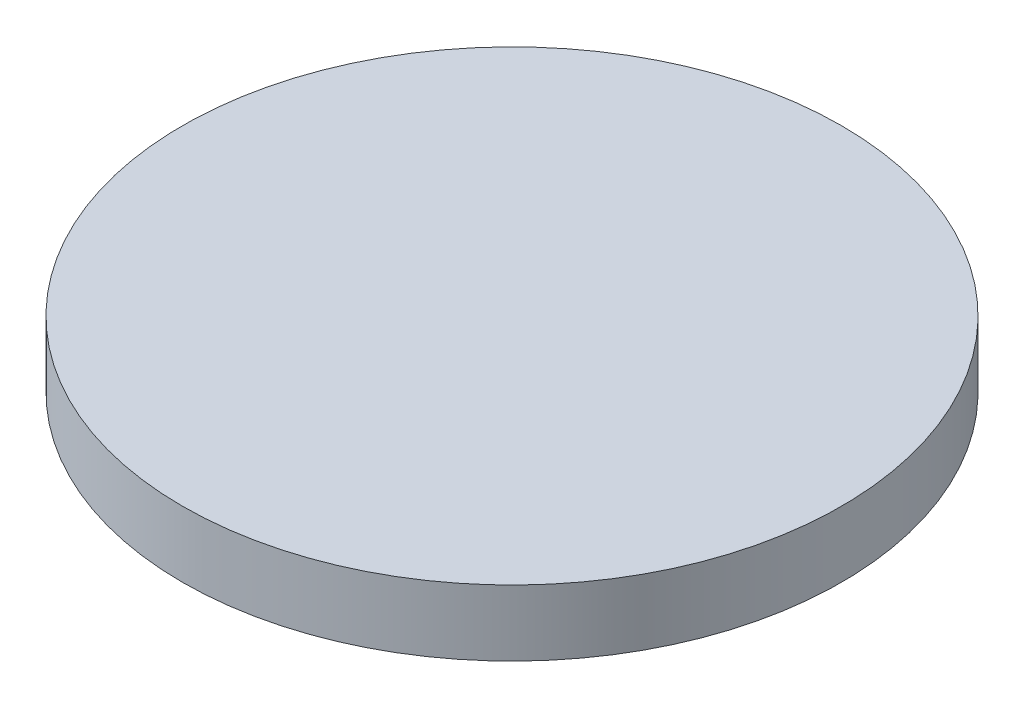
ISO-10303-21;
HEADER;
FILE_DESCRIPTION(('STEP AP214'),'2;1');
FILE_NAME('part.step','',(''),(''),'','','');
FILE_SCHEMA(('AUTOMOTIVE_DESIGN { 1 0 10303 214 1 1 1 1 }'));
ENDSEC;
DATA;
#1=APPLICATION_CONTEXT('core data for automotive mechanical design processes');
#2=APPLICATION_PROTOCOL_DEFINITION('international standard','automotive_design',2000,#1);
#3=PRODUCT_CONTEXT('',#1,'mechanical');
#4=PRODUCT('Part','Part','',(#3));
#5=PRODUCT_RELATED_PRODUCT_CATEGORY('part','',(#4));
#6=PRODUCT_DEFINITION_FORMATION('','',#4);
#7=PRODUCT_DEFINITION_CONTEXT('part definition',#1,'design');
#8=PRODUCT_DEFINITION('design','',#6,#7);
#9=PRODUCT_DEFINITION_SHAPE('','',#8);
#10=(LENGTH_UNIT() NAMED_UNIT(*) SI_UNIT(.MILLI.,.METRE.));
#11=(NAMED_UNIT(*) PLANE_ANGLE_UNIT() SI_UNIT($,.RADIAN.));
#12=(NAMED_UNIT(*) SI_UNIT($,.STERADIAN.) SOLID_ANGLE_UNIT());
#13=UNCERTAINTY_MEASURE_WITH_UNIT(LENGTH_MEASURE(1.E-05),#10,'distance_accuracy_value','');
#14=(GEOMETRIC_REPRESENTATION_CONTEXT(3) GLOBAL_UNCERTAINTY_ASSIGNED_CONTEXT((#13)) GLOBAL_UNIT_ASSIGNED_CONTEXT((#10,
#11,#12)) REPRESENTATION_CONTEXT('',''));
#15=CARTESIAN_POINT('',(0.,0.,0.));
#16=DIRECTION('',(0.,0.,1.));
#17=DIRECTION('',(1.,0.,0.));
#18=AXIS2_PLACEMENT_3D('',#15,#16,#17);
#19=CARTESIAN_POINT('',(0.,1.6,0.));
#20=DIRECTION('',(0.,-1.,0.));
#21=DIRECTION('',(0.,0.,-1.));
#22=AXIS2_PLACEMENT_3D('',#19,#20,#21);
#23=CYLINDRICAL_SURFACE('',#22,8.);
#24=CARTESIAN_POINT('',(0.,1.6,0.));
#25=DIRECTION('',(0.,1.,0.));
#26=DIRECTION('',(0.,0.,1.));
#27=AXIS2_PLACEMENT_3D('',#24,#25,#26);
#28=CIRCLE('',#27,8.);
#29=CARTESIAN_POINT('',(0.,1.6,8.));
#30=VERTEX_POINT('',#29);
#31=EDGE_CURVE('E10',#30,#30,#28,.T.);
#32=ORIENTED_EDGE('',*,*,#31,.F.);
#33=EDGE_LOOP('',(#32));
#34=FACE_BOUND('',#33,.T.);
#35=CARTESIAN_POINT('',(0.,0.,0.));
#36=DIRECTION('',(0.,1.,0.));
#37=DIRECTION('',(0.,0.,1.));
#38=AXIS2_PLACEMENT_3D('',#35,#36,#37);
#39=CIRCLE('',#38,8.);
#40=CARTESIAN_POINT('',(0.,0.,8.));
#41=VERTEX_POINT('',#40);
#42=EDGE_CURVE('E34',#41,#41,#39,.T.);
#43=ORIENTED_EDGE('',*,*,#42,.T.);
#44=EDGE_LOOP('',(#43));
#45=FACE_BOUND('',#44,.T.);
#46=ADVANCED_FACE('F31',(#34,#45),#23,.T.);
#47=CARTESIAN_POINT('',(0.,1.6,0.));
#48=DIRECTION('',(0.,1.,0.));
#49=DIRECTION('',(0.,0.,1.));
#50=AXIS2_PLACEMENT_3D('',#47,#48,#49);
#51=PLANE('',#50);
#52=ORIENTED_EDGE('',*,*,#31,.T.);
#53=EDGE_LOOP('',(#52));
#54=FACE_BOUND('',#53,.T.);
#55=ADVANCED_FACE('F46',(#54),#51,.T.);
#56=CARTESIAN_POINT('',(0.,0.,0.));
#57=DIRECTION('',(0.,1.,0.));
#58=DIRECTION('',(0.,0.,1.));
#59=AXIS2_PLACEMENT_3D('',#56,#57,#58);
#60=PLANE('',#59);
#61=ORIENTED_EDGE('',*,*,#42,.F.);
#62=EDGE_LOOP('',(#61));
#63=FACE_BOUND('',#62,.T.);
#64=ADVANCED_FACE('F44',(#63),#60,.F.);
#65=CLOSED_SHELL('',(#46,#55,#64));
#66=MANIFOLD_SOLID_BREP('B2',#65);
#67=ADVANCED_BREP_SHAPE_REPRESENTATION('',(#18,#66),#14);
#68=SHAPE_DEFINITION_REPRESENTATION(#9,#67);
ENDSEC;
END-ISO-10303-21;
